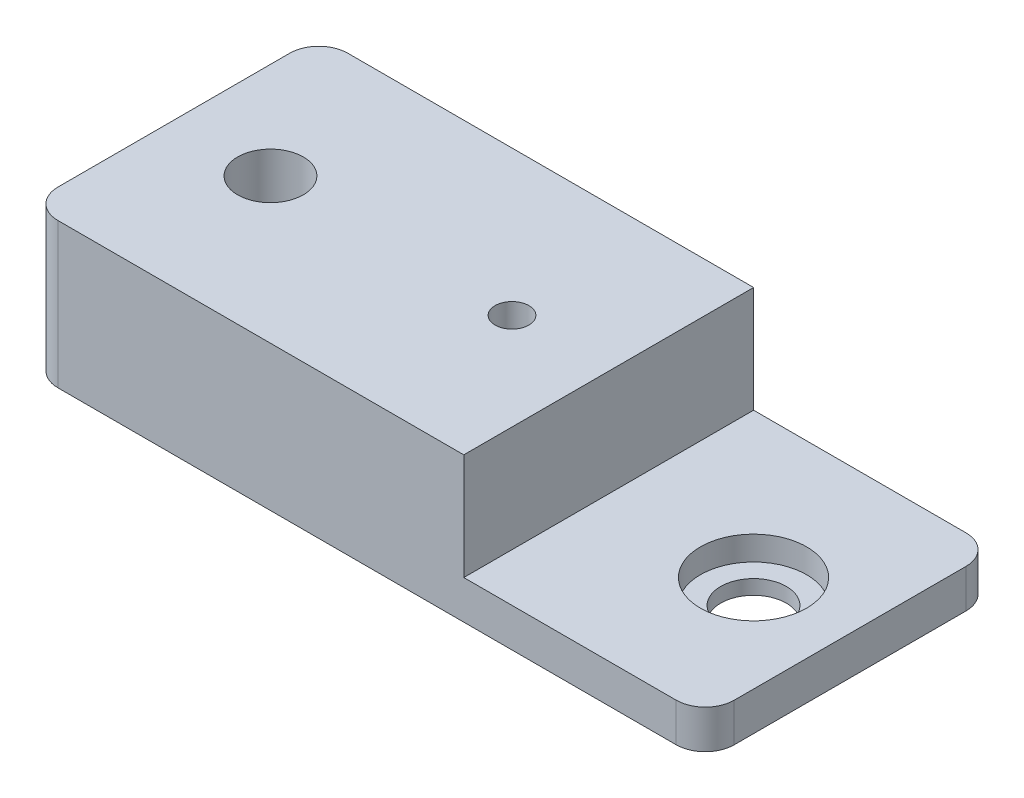
ISO-10303-21;
HEADER;
FILE_DESCRIPTION(('STEP AP214'),'2;1');
FILE_NAME('part.step','',(''),(''),'','','');
FILE_SCHEMA(('AUTOMOTIVE_DESIGN { 1 0 10303 214 1 1 1 1 }'));
ENDSEC;
DATA;
#1=APPLICATION_CONTEXT('core data for automotive mechanical design processes');
#2=APPLICATION_PROTOCOL_DEFINITION('international standard','automotive_design',2000,#1);
#3=PRODUCT_CONTEXT('',#1,'mechanical');
#4=PRODUCT('Part','Part','',(#3));
#5=PRODUCT_RELATED_PRODUCT_CATEGORY('part','',(#4));
#6=PRODUCT_DEFINITION_FORMATION('','',#4);
#7=PRODUCT_DEFINITION_CONTEXT('part definition',#1,'design');
#8=PRODUCT_DEFINITION('design','',#6,#7);
#9=PRODUCT_DEFINITION_SHAPE('','',#8);
#10=(LENGTH_UNIT() NAMED_UNIT(*) SI_UNIT(.MILLI.,.METRE.));
#11=(NAMED_UNIT(*) PLANE_ANGLE_UNIT() SI_UNIT($,.RADIAN.));
#12=(NAMED_UNIT(*) SI_UNIT($,.STERADIAN.) SOLID_ANGLE_UNIT());
#13=UNCERTAINTY_MEASURE_WITH_UNIT(LENGTH_MEASURE(1.E-05),#10,'distance_accuracy_value','');
#14=(GEOMETRIC_REPRESENTATION_CONTEXT(3) GLOBAL_UNCERTAINTY_ASSIGNED_CONTEXT((#13)) GLOBAL_UNIT_ASSIGNED_CONTEXT((#10,
#11,#12)) REPRESENTATION_CONTEXT('',''));
#15=CARTESIAN_POINT('',(0.,0.,0.));
#16=DIRECTION('',(0.,0.,1.));
#17=DIRECTION('',(1.,0.,0.));
#18=AXIS2_PLACEMENT_3D('',#15,#16,#17);
#19=CARTESIAN_POINT('',(25.,0.,0.));
#20=DIRECTION('',(0.,1.,0.));
#21=DIRECTION('',(0.,0.,1.));
#22=AXIS2_PLACEMENT_3D('',#19,#20,#21);
#23=CYLINDRICAL_SURFACE('',#22,3.4);
#24=CARTESIAN_POINT('',(25.,0.,0.));
#25=DIRECTION('',(0.,1.,0.));
#26=DIRECTION('',(0.,0.,1.));
#27=AXIS2_PLACEMENT_3D('',#24,#25,#26);
#28=CIRCLE('',#27,3.4);
#29=CARTESIAN_POINT('',(25.,0.,3.4));
#30=VERTEX_POINT('',#29);
#31=EDGE_CURVE('E229',#30,#30,#28,.T.);
#32=ORIENTED_EDGE('',*,*,#31,.F.);
#33=EDGE_LOOP('',(#32));
#34=FACE_BOUND('',#33,.T.);
#35=CARTESIAN_POINT('',(25.,1.5,0.));
#36=DIRECTION('',(0.,1.,0.));
#37=DIRECTION('',(0.,0.,1.));
#38=AXIS2_PLACEMENT_3D('',#35,#36,#37);
#39=CIRCLE('',#38,3.4);
#40=CARTESIAN_POINT('',(25.,1.5,3.4));
#41=VERTEX_POINT('',#40);
#42=EDGE_CURVE('E45',#41,#41,#39,.F.);
#43=ORIENTED_EDGE('',*,*,#42,.F.);
#44=EDGE_LOOP('',(#43));
#45=FACE_BOUND('',#44,.T.);
#46=ADVANCED_FACE('F41',(#34,#45),#23,.F.);
#47=CARTESIAN_POINT('',(0.,0.,0.));
#48=DIRECTION('',(0.,1.,0.));
#49=DIRECTION('',(0.,0.,1.));
#50=AXIS2_PLACEMENT_3D('',#47,#48,#49);
#51=CYLINDRICAL_SURFACE('',#50,1.75);
#52=CARTESIAN_POINT('',(0.,15.,0.));
#53=DIRECTION('',(0.,1.,0.));
#54=DIRECTION('',(0.,0.,1.));
#55=AXIS2_PLACEMENT_3D('',#52,#53,#54);
#56=CIRCLE('',#55,1.75);
#57=CARTESIAN_POINT('',(0.,15.,1.75));
#58=VERTEX_POINT('',#57);
#59=EDGE_CURVE('E189',#58,#58,#56,.T.);
#60=ORIENTED_EDGE('',*,*,#59,.T.);
#61=EDGE_LOOP('',(#60));
#62=FACE_BOUND('',#61,.T.);
#63=CARTESIAN_POINT('',(0.,7.8,0.));
#64=DIRECTION('',(0.,-1.,0.));
#65=DIRECTION('',(0.,0.,-1.));
#66=AXIS2_PLACEMENT_3D('',#63,#64,#65);
#67=CIRCLE('',#66,1.75);
#68=CARTESIAN_POINT('',(0.,7.8,-1.75));
#69=VERTEX_POINT('',#68);
#70=EDGE_CURVE('E227',#69,#69,#67,.F.);
#71=ORIENTED_EDGE('',*,*,#70,.F.);
#72=EDGE_LOOP('',(#71));
#73=FACE_BOUND('',#72,.T.);
#74=ADVANCED_FACE('F276',(#62,#73),#51,.F.);
#75=CARTESIAN_POINT('',(35.,15.,15.));
#76=DIRECTION('',(-1.,0.,0.));
#77=DIRECTION('',(0.,0.,1.));
#78=AXIS2_PLACEMENT_3D('',#75,#76,#77);
#79=PLANE('',#78);
#80=DIRECTION('',(0.,-1.,0.));
#81=VECTOR('',#80,1.);
#82=CARTESIAN_POINT('',(35.,15.,-12.));
#83=LINE('',#82,#81);
#84=CARTESIAN_POINT('',(35.,0.,-12.));
#85=VERTEX_POINT('',#84);
#86=CARTESIAN_POINT('',(35.,4.,-12.));
#87=VERTEX_POINT('',#86);
#88=EDGE_CURVE('E213',#85,#87,#83,.F.);
#89=ORIENTED_EDGE('',*,*,#88,.T.);
#90=DIRECTION('',(0.,0.,1.));
#91=VECTOR('',#90,1.);
#92=CARTESIAN_POINT('',(35.,4.,15.));
#93=LINE('',#92,#91);
#94=CARTESIAN_POINT('',(35.,4.,12.));
#95=VERTEX_POINT('',#94);
#96=EDGE_CURVE('E478',#87,#95,#93,.T.);
#97=ORIENTED_EDGE('',*,*,#96,.T.);
#98=DIRECTION('',(0.,-1.,0.));
#99=VECTOR('',#98,1.);
#100=CARTESIAN_POINT('',(35.,15.,12.));
#101=LINE('',#100,#99);
#102=CARTESIAN_POINT('',(35.,0.,12.));
#103=VERTEX_POINT('',#102);
#104=EDGE_CURVE('E211',#95,#103,#101,.T.);
#105=ORIENTED_EDGE('',*,*,#104,.T.);
#106=DIRECTION('',(0.,0.,-1.));
#107=VECTOR('',#106,1.);
#108=CARTESIAN_POINT('',(35.,0.,15.));
#109=LINE('',#108,#107);
#110=EDGE_CURVE('E193',#103,#85,#109,.T.);
#111=ORIENTED_EDGE('',*,*,#110,.T.);
#112=EDGE_LOOP('',(#89,#97,#105,#111));
#113=FACE_BOUND('',#112,.T.);
#114=ADVANCED_FACE('F279',(#113),#79,.F.);
#115=CARTESIAN_POINT('',(-35.,15.,-15.));
#116=DIRECTION('',(0.,0.,1.));
#117=DIRECTION('',(1.,0.,0.));
#118=AXIS2_PLACEMENT_3D('',#115,#116,#117);
#119=PLANE('',#118);
#120=DIRECTION('',(-1.,0.,0.));
#121=VECTOR('',#120,1.);
#122=CARTESIAN_POINT('',(-35.,15.,-15.));
#123=LINE('',#122,#121);
#124=CARTESIAN_POINT('',(10.0086904172408,15.,-15.));
#125=VERTEX_POINT('',#124);
#126=CARTESIAN_POINT('',(-32.,15.,-15.));
#127=VERTEX_POINT('',#126);
#128=EDGE_CURVE('E170',#125,#127,#123,.T.);
#129=ORIENTED_EDGE('',*,*,#128,.F.);
#130=DIRECTION('',(0.,-1.,0.));
#131=VECTOR('',#130,1.);
#132=CARTESIAN_POINT('',(10.0086904172408,15.,-15.));
#133=LINE('',#132,#131);
#134=CARTESIAN_POINT('',(10.0086904172408,4.,-15.));
#135=VERTEX_POINT('',#134);
#136=EDGE_CURVE('E156',#125,#135,#133,.T.);
#137=ORIENTED_EDGE('',*,*,#136,.T.);
#138=DIRECTION('',(1.,0.,0.));
#139=VECTOR('',#138,1.);
#140=CARTESIAN_POINT('',(-35.,4.,-15.));
#141=LINE('',#140,#139);
#142=CARTESIAN_POINT('',(32.,4.,-15.));
#143=VERTEX_POINT('',#142);
#144=EDGE_CURVE('E321',#135,#143,#141,.T.);
#145=ORIENTED_EDGE('',*,*,#144,.T.);
#146=DIRECTION('',(0.,-1.,0.));
#147=VECTOR('',#146,1.);
#148=CARTESIAN_POINT('',(32.,15.,-15.));
#149=LINE('',#148,#147);
#150=CARTESIAN_POINT('',(32.,0.,-15.));
#151=VERTEX_POINT('',#150);
#152=EDGE_CURVE('E201',#143,#151,#149,.T.);
#153=ORIENTED_EDGE('',*,*,#152,.T.);
#154=DIRECTION('',(-1.,0.,0.));
#155=VECTOR('',#154,1.);
#156=CARTESIAN_POINT('',(-35.,0.,-15.));
#157=LINE('',#156,#155);
#158=CARTESIAN_POINT('',(-32.,0.,-15.));
#159=VERTEX_POINT('',#158);
#160=EDGE_CURVE('E196',#151,#159,#157,.T.);
#161=ORIENTED_EDGE('',*,*,#160,.T.);
#162=DIRECTION('',(0.,-1.,0.));
#163=VECTOR('',#162,1.);
#164=CARTESIAN_POINT('',(-32.,15.,-15.));
#165=LINE('',#164,#163);
#166=EDGE_CURVE('E178',#159,#127,#165,.F.);
#167=ORIENTED_EDGE('',*,*,#166,.T.);
#168=EDGE_LOOP('',(#129,#137,#145,#153,#161,#167));
#169=FACE_BOUND('',#168,.T.);
#170=ADVANCED_FACE('F175',(#169),#119,.F.);
#171=CARTESIAN_POINT('',(-35.,15.,15.));
#172=DIRECTION('',(1.,0.,0.));
#173=DIRECTION('',(0.,0.,-1.));
#174=AXIS2_PLACEMENT_3D('',#171,#172,#173);
#175=PLANE('',#174);
#176=DIRECTION('',(0.,0.,1.));
#177=VECTOR('',#176,1.);
#178=CARTESIAN_POINT('',(-35.,0.,15.));
#179=LINE('',#178,#177);
#180=CARTESIAN_POINT('',(-35.,0.,-12.));
#181=VERTEX_POINT('',#180);
#182=CARTESIAN_POINT('',(-35.,0.,12.));
#183=VERTEX_POINT('',#182);
#184=EDGE_CURVE('E186',#181,#183,#179,.T.);
#185=ORIENTED_EDGE('',*,*,#184,.T.);
#186=DIRECTION('',(0.,-1.,0.));
#187=VECTOR('',#186,1.);
#188=CARTESIAN_POINT('',(-35.,15.,12.));
#189=LINE('',#188,#187);
#190=CARTESIAN_POINT('',(-35.,15.,12.));
#191=VERTEX_POINT('',#190);
#192=EDGE_CURVE('E11',#183,#191,#189,.F.);
#193=ORIENTED_EDGE('',*,*,#192,.T.);
#194=DIRECTION('',(0.,0.,1.));
#195=VECTOR('',#194,1.);
#196=CARTESIAN_POINT('',(-35.,15.,15.));
#197=LINE('',#196,#195);
#198=CARTESIAN_POINT('',(-35.,15.,-12.));
#199=VERTEX_POINT('',#198);
#200=EDGE_CURVE('E180',#199,#191,#197,.T.);
#201=ORIENTED_EDGE('',*,*,#200,.F.);
#202=DIRECTION('',(0.,-1.,0.));
#203=VECTOR('',#202,1.);
#204=CARTESIAN_POINT('',(-35.,15.,-12.));
#205=LINE('',#204,#203);
#206=EDGE_CURVE('E50',#199,#181,#205,.T.);
#207=ORIENTED_EDGE('',*,*,#206,.T.);
#208=EDGE_LOOP('',(#185,#193,#201,#207));
#209=FACE_BOUND('',#208,.T.);
#210=ADVANCED_FACE('F296',(#209),#175,.F.);
#211=CARTESIAN_POINT('',(-35.,15.,15.));
#212=DIRECTION('',(0.,0.,-1.));
#213=DIRECTION('',(-1.,0.,0.));
#214=AXIS2_PLACEMENT_3D('',#211,#212,#213);
#215=PLANE('',#214);
#216=DIRECTION('',(-1.,0.,0.));
#217=VECTOR('',#216,1.);
#218=CARTESIAN_POINT('',(-35.,4.,15.));
#219=LINE('',#218,#217);
#220=CARTESIAN_POINT('',(32.,4.,15.));
#221=VERTEX_POINT('',#220);
#222=CARTESIAN_POINT('',(10.0086904172408,4.,15.));
#223=VERTEX_POINT('',#222);
#224=EDGE_CURVE('E58',#221,#223,#219,.T.);
#225=ORIENTED_EDGE('',*,*,#224,.T.);
#226=DIRECTION('',(0.,1.,0.));
#227=VECTOR('',#226,1.);
#228=CARTESIAN_POINT('',(10.0086904172408,15.,15.));
#229=LINE('',#228,#227);
#230=CARTESIAN_POINT('',(10.0086904172408,15.,15.));
#231=VERTEX_POINT('',#230);
#232=EDGE_CURVE('E165',#223,#231,#229,.T.);
#233=ORIENTED_EDGE('',*,*,#232,.T.);
#234=DIRECTION('',(1.,0.,0.));
#235=VECTOR('',#234,1.);
#236=CARTESIAN_POINT('',(-35.,15.,15.));
#237=LINE('',#236,#235);
#238=CARTESIAN_POINT('',(-32.,15.,15.));
#239=VERTEX_POINT('',#238);
#240=EDGE_CURVE('E173',#239,#231,#237,.T.);
#241=ORIENTED_EDGE('',*,*,#240,.F.);
#242=DIRECTION('',(0.,-1.,0.));
#243=VECTOR('',#242,1.);
#244=CARTESIAN_POINT('',(-32.,15.,15.));
#245=LINE('',#244,#243);
#246=CARTESIAN_POINT('',(-32.,0.,15.));
#247=VERTEX_POINT('',#246);
#248=EDGE_CURVE('E220',#239,#247,#245,.T.);
#249=ORIENTED_EDGE('',*,*,#248,.T.);
#250=DIRECTION('',(1.,0.,0.));
#251=VECTOR('',#250,1.);
#252=CARTESIAN_POINT('',(-35.,0.,15.));
#253=LINE('',#252,#251);
#254=CARTESIAN_POINT('',(32.,0.,15.));
#255=VERTEX_POINT('',#254);
#256=EDGE_CURVE('E181',#247,#255,#253,.T.);
#257=ORIENTED_EDGE('',*,*,#256,.T.);
#258=DIRECTION('',(0.,-1.,0.));
#259=VECTOR('',#258,1.);
#260=CARTESIAN_POINT('',(32.,15.,15.));
#261=LINE('',#260,#259);
#262=EDGE_CURVE('E223',#255,#221,#261,.F.);
#263=ORIENTED_EDGE('',*,*,#262,.T.);
#264=EDGE_LOOP('',(#225,#233,#241,#249,#257,#263));
#265=FACE_BOUND('',#264,.T.);
#266=ADVANCED_FACE('F271',(#265),#215,.F.);
#267=CARTESIAN_POINT('',(0.,15.,0.));
#268=DIRECTION('',(0.,-1.,0.));
#269=DIRECTION('',(0.,0.,-1.));
#270=AXIS2_PLACEMENT_3D('',#267,#268,#269);
#271=PLANE('',#270);
#272=CARTESIAN_POINT('',(-25.,15.,0.));
#273=DIRECTION('',(0.,1.,0.));
#274=DIRECTION('',(0.,0.,1.));
#275=AXIS2_PLACEMENT_3D('',#272,#273,#274);
#276=CIRCLE('',#275,3.4);
#277=CARTESIAN_POINT('',(-25.,15.,3.4));
#278=VERTEX_POINT('',#277);
#279=EDGE_CURVE('E253',#278,#278,#276,.T.);
#280=ORIENTED_EDGE('',*,*,#279,.F.);
#281=EDGE_LOOP('',(#280));
#282=FACE_BOUND('',#281,.T.);
#283=ORIENTED_EDGE('',*,*,#59,.F.);
#284=EDGE_LOOP('',(#283));
#285=FACE_BOUND('',#284,.T.);
#286=ORIENTED_EDGE('',*,*,#240,.T.);
#287=DIRECTION('',(0.,0.,1.));
#288=VECTOR('',#287,1.);
#289=CARTESIAN_POINT('',(10.0086904172408,15.,-16.8498165974971));
#290=LINE('',#289,#288);
#291=EDGE_CURVE('E159',#125,#231,#290,.T.);
#292=ORIENTED_EDGE('',*,*,#291,.F.);
#293=ORIENTED_EDGE('',*,*,#128,.T.);
#294=CARTESIAN_POINT('',(-32.,15.,-12.));
#295=DIRECTION('',(0.,-1.,0.));
#296=DIRECTION('',(0.,0.,-1.));
#297=AXIS2_PLACEMENT_3D('',#294,#295,#296);
#298=CIRCLE('',#297,3.);
#299=EDGE_CURVE('E216',#127,#199,#298,.F.);
#300=ORIENTED_EDGE('',*,*,#299,.T.);
#301=ORIENTED_EDGE('',*,*,#200,.T.);
#302=CARTESIAN_POINT('',(-32.,15.,12.));
#303=DIRECTION('',(0.,-1.,0.));
#304=DIRECTION('',(0.,0.,-1.));
#305=AXIS2_PLACEMENT_3D('',#302,#303,#304);
#306=CIRCLE('',#305,3.);
#307=EDGE_CURVE('E218',#191,#239,#306,.F.);
#308=ORIENTED_EDGE('',*,*,#307,.T.);
#309=EDGE_LOOP('',(#286,#292,#293,#300,#301,#308));
#310=FACE_BOUND('',#309,.T.);
#311=ADVANCED_FACE('F169',(#282,#285,#310),#271,.F.);
#312=CARTESIAN_POINT('',(0.,0.,0.));
#313=DIRECTION('',(0.,-1.,0.));
#314=DIRECTION('',(0.,0.,-1.));
#315=AXIS2_PLACEMENT_3D('',#312,#313,#314);
#316=PLANE('',#315);
#317=DIRECTION('',(-0.866025403784439,0.,0.5));
#318=VECTOR('',#317,1.);
#319=CARTESIAN_POINT('',(3.1,0.,1.78978583448784));
#320=LINE('',#319,#318);
#321=CARTESIAN_POINT('',(3.1,0.,1.78978583448784));
#322=VERTEX_POINT('',#321);
#323=CARTESIAN_POINT('',(0.,0.,3.57957166897568));
#324=VERTEX_POINT('',#323);
#325=EDGE_CURVE('E66',#322,#324,#320,.T.);
#326=ORIENTED_EDGE('',*,*,#325,.F.);
#327=DIRECTION('',(0.,0.,1.));
#328=VECTOR('',#327,1.);
#329=CARTESIAN_POINT('',(3.1,0.,-1.78978583448784));
#330=LINE('',#329,#328);
#331=CARTESIAN_POINT('',(3.1,0.,-1.78978583448784));
#332=VERTEX_POINT('',#331);
#333=EDGE_CURVE('E242',#332,#322,#330,.T.);
#334=ORIENTED_EDGE('',*,*,#333,.F.);
#335=DIRECTION('',(0.866025403784439,0.,0.5));
#336=VECTOR('',#335,1.);
#337=CARTESIAN_POINT('',(0.,0.,-3.57957166897568));
#338=LINE('',#337,#336);
#339=CARTESIAN_POINT('',(0.,0.,-3.57957166897568));
#340=VERTEX_POINT('',#339);
#341=EDGE_CURVE('E353',#340,#332,#338,.T.);
#342=ORIENTED_EDGE('',*,*,#341,.F.);
#343=DIRECTION('',(0.866025403784439,0.,-0.5));
#344=VECTOR('',#343,1.);
#345=CARTESIAN_POINT('',(-3.1,0.,-1.78978583448784));
#346=LINE('',#345,#344);
#347=CARTESIAN_POINT('',(-3.1,0.,-1.78978583448784));
#348=VERTEX_POINT('',#347);
#349=EDGE_CURVE('E351',#348,#340,#346,.T.);
#350=ORIENTED_EDGE('',*,*,#349,.F.);
#351=DIRECTION('',(0.,0.,-1.));
#352=VECTOR('',#351,1.);
#353=CARTESIAN_POINT('',(-3.1,0.,1.78978583448784));
#354=LINE('',#353,#352);
#355=CARTESIAN_POINT('',(-3.1,0.,1.78978583448784));
#356=VERTEX_POINT('',#355);
#357=EDGE_CURVE('E348',#356,#348,#354,.T.);
#358=ORIENTED_EDGE('',*,*,#357,.F.);
#359=DIRECTION('',(-0.866025403784439,0.,-0.5));
#360=VECTOR('',#359,1.);
#361=CARTESIAN_POINT('',(0.,0.,3.57957166897568));
#362=LINE('',#361,#360);
#363=EDGE_CURVE('E345',#324,#356,#362,.T.);
#364=ORIENTED_EDGE('',*,*,#363,.F.);
#365=EDGE_LOOP('',(#326,#334,#342,#350,#358,#364));
#366=FACE_BOUND('',#365,.T.);
#367=ORIENTED_EDGE('',*,*,#31,.T.);
#368=EDGE_LOOP('',(#367));
#369=FACE_BOUND('',#368,.T.);
#370=CARTESIAN_POINT('',(-25.,0.,0.));
#371=DIRECTION('',(0.,1.,0.));
#372=DIRECTION('',(0.,0.,1.));
#373=AXIS2_PLACEMENT_3D('',#370,#371,#372);
#374=CIRCLE('',#373,3.4);
#375=CARTESIAN_POINT('',(-25.,0.,3.4));
#376=VERTEX_POINT('',#375);
#377=EDGE_CURVE('E234',#376,#376,#374,.T.);
#378=ORIENTED_EDGE('',*,*,#377,.T.);
#379=EDGE_LOOP('',(#378));
#380=FACE_BOUND('',#379,.T.);
#381=ORIENTED_EDGE('',*,*,#160,.F.);
#382=CARTESIAN_POINT('',(32.,0.,-12.));
#383=DIRECTION('',(0.,-1.,0.));
#384=DIRECTION('',(0.,0.,-1.));
#385=AXIS2_PLACEMENT_3D('',#382,#383,#384);
#386=CIRCLE('',#385,3.);
#387=EDGE_CURVE('E209',#151,#85,#386,.T.);
#388=ORIENTED_EDGE('',*,*,#387,.T.);
#389=ORIENTED_EDGE('',*,*,#110,.F.);
#390=CARTESIAN_POINT('',(32.,0.,12.));
#391=DIRECTION('',(0.,-1.,0.));
#392=DIRECTION('',(0.,0.,-1.));
#393=AXIS2_PLACEMENT_3D('',#390,#391,#392);
#394=CIRCLE('',#393,3.);
#395=EDGE_CURVE('E207',#103,#255,#394,.T.);
#396=ORIENTED_EDGE('',*,*,#395,.T.);
#397=ORIENTED_EDGE('',*,*,#256,.F.);
#398=CARTESIAN_POINT('',(-32.,0.,12.));
#399=DIRECTION('',(0.,-1.,0.));
#400=DIRECTION('',(0.,0.,-1.));
#401=AXIS2_PLACEMENT_3D('',#398,#399,#400);
#402=CIRCLE('',#401,3.);
#403=EDGE_CURVE('E205',#247,#183,#402,.T.);
#404=ORIENTED_EDGE('',*,*,#403,.T.);
#405=ORIENTED_EDGE('',*,*,#184,.F.);
#406=CARTESIAN_POINT('',(-32.,0.,-12.));
#407=DIRECTION('',(0.,-1.,0.));
#408=DIRECTION('',(0.,0.,-1.));
#409=AXIS2_PLACEMENT_3D('',#406,#407,#408);
#410=CIRCLE('',#409,3.);
#411=EDGE_CURVE('E203',#181,#159,#410,.T.);
#412=ORIENTED_EDGE('',*,*,#411,.T.);
#413=EDGE_LOOP('',(#381,#388,#389,#396,#397,#404,#405,#412));
#414=FACE_BOUND('',#413,.T.);
#415=ADVANCED_FACE('F259',(#366,#369,#380,#414),#316,.T.);
#416=CARTESIAN_POINT('',(32.,15.,-12.));
#417=DIRECTION('',(0.,-1.,0.));
#418=DIRECTION('',(0.,0.,-1.));
#419=AXIS2_PLACEMENT_3D('',#416,#417,#418);
#420=CYLINDRICAL_SURFACE('',#419,3.);
#421=CARTESIAN_POINT('',(32.,4.,-12.));
#422=DIRECTION('',(0.,-1.,0.));
#423=DIRECTION('',(0.,0.,-1.));
#424=AXIS2_PLACEMENT_3D('',#421,#422,#423);
#425=CIRCLE('',#424,3.);
#426=EDGE_CURVE('E323',#87,#143,#425,.F.);
#427=ORIENTED_EDGE('',*,*,#426,.F.);
#428=ORIENTED_EDGE('',*,*,#88,.F.);
#429=ORIENTED_EDGE('',*,*,#387,.F.);
#430=ORIENTED_EDGE('',*,*,#152,.F.);
#431=EDGE_LOOP('',(#427,#428,#429,#430));
#432=FACE_BOUND('',#431,.T.);
#433=ADVANCED_FACE('F292',(#432),#420,.T.);
#434=CARTESIAN_POINT('',(32.,15.,12.));
#435=DIRECTION('',(0.,-1.,0.));
#436=DIRECTION('',(0.,0.,-1.));
#437=AXIS2_PLACEMENT_3D('',#434,#435,#436);
#438=CYLINDRICAL_SURFACE('',#437,3.);
#439=CARTESIAN_POINT('',(32.,4.,12.));
#440=DIRECTION('',(0.,-1.,0.));
#441=DIRECTION('',(0.,0.,-1.));
#442=AXIS2_PLACEMENT_3D('',#439,#440,#441);
#443=CIRCLE('',#442,3.);
#444=EDGE_CURVE('E474',#221,#95,#443,.F.);
#445=ORIENTED_EDGE('',*,*,#444,.F.);
#446=ORIENTED_EDGE('',*,*,#262,.F.);
#447=ORIENTED_EDGE('',*,*,#395,.F.);
#448=ORIENTED_EDGE('',*,*,#104,.F.);
#449=EDGE_LOOP('',(#445,#446,#447,#448));
#450=FACE_BOUND('',#449,.T.);
#451=ADVANCED_FACE('F305',(#450),#438,.T.);
#452=CARTESIAN_POINT('',(-32.,15.,12.));
#453=DIRECTION('',(0.,-1.,0.));
#454=DIRECTION('',(0.,0.,-1.));
#455=AXIS2_PLACEMENT_3D('',#452,#453,#454);
#456=CYLINDRICAL_SURFACE('',#455,3.);
#457=ORIENTED_EDGE('',*,*,#307,.F.);
#458=ORIENTED_EDGE('',*,*,#192,.F.);
#459=ORIENTED_EDGE('',*,*,#403,.F.);
#460=ORIENTED_EDGE('',*,*,#248,.F.);
#461=EDGE_LOOP('',(#457,#458,#459,#460));
#462=FACE_BOUND('',#461,.T.);
#463=ADVANCED_FACE('F308',(#462),#456,.T.);
#464=CARTESIAN_POINT('',(-32.,15.,-12.));
#465=DIRECTION('',(0.,-1.,0.));
#466=DIRECTION('',(0.,0.,-1.));
#467=AXIS2_PLACEMENT_3D('',#464,#465,#466);
#468=CYLINDRICAL_SURFACE('',#467,3.);
#469=ORIENTED_EDGE('',*,*,#299,.F.);
#470=ORIENTED_EDGE('',*,*,#166,.F.);
#471=ORIENTED_EDGE('',*,*,#411,.F.);
#472=ORIENTED_EDGE('',*,*,#206,.F.);
#473=EDGE_LOOP('',(#469,#470,#471,#472));
#474=FACE_BOUND('',#473,.T.);
#475=ADVANCED_FACE('F43',(#474),#468,.T.);
#476=CARTESIAN_POINT('',(-25.,0.,0.));
#477=DIRECTION('',(0.,1.,0.));
#478=DIRECTION('',(0.,0.,1.));
#479=AXIS2_PLACEMENT_3D('',#476,#477,#478);
#480=CYLINDRICAL_SURFACE('',#479,3.4);
#481=ORIENTED_EDGE('',*,*,#377,.F.);
#482=EDGE_LOOP('',(#481));
#483=FACE_BOUND('',#482,.T.);
#484=ORIENTED_EDGE('',*,*,#279,.T.);
#485=EDGE_LOOP('',(#484));
#486=FACE_BOUND('',#485,.T.);
#487=ADVANCED_FACE('F262',(#483,#486),#480,.F.);
#488=CARTESIAN_POINT('',(0.,7.8,0.));
#489=DIRECTION('',(0.,-1.,0.));
#490=DIRECTION('',(0.,0.,-1.));
#491=AXIS2_PLACEMENT_3D('',#488,#489,#490);
#492=PLANE('',#491);
#493=DIRECTION('',(-0.866025403784439,0.,0.5));
#494=VECTOR('',#493,1.);
#495=CARTESIAN_POINT('',(3.1,7.8,1.78978583448784));
#496=LINE('',#495,#494);
#497=CARTESIAN_POINT('',(3.1,7.8,1.78978583448784));
#498=VERTEX_POINT('',#497);
#499=CARTESIAN_POINT('',(0.,7.8,3.57957166897568));
#500=VERTEX_POINT('',#499);
#501=EDGE_CURVE('E327',#498,#500,#496,.T.);
#502=ORIENTED_EDGE('',*,*,#501,.T.);
#503=DIRECTION('',(-0.866025403784439,0.,-0.5));
#504=VECTOR('',#503,1.);
#505=CARTESIAN_POINT('',(0.,7.8,3.57957166897568));
#506=LINE('',#505,#504);
#507=CARTESIAN_POINT('',(-3.1,7.8,1.78978583448784));
#508=VERTEX_POINT('',#507);
#509=EDGE_CURVE('E330',#500,#508,#506,.T.);
#510=ORIENTED_EDGE('',*,*,#509,.T.);
#511=DIRECTION('',(0.,0.,-1.));
#512=VECTOR('',#511,1.);
#513=CARTESIAN_POINT('',(-3.1,7.8,1.78978583448784));
#514=LINE('',#513,#512);
#515=CARTESIAN_POINT('',(-3.1,7.8,-1.78978583448784));
#516=VERTEX_POINT('',#515);
#517=EDGE_CURVE('E333',#508,#516,#514,.T.);
#518=ORIENTED_EDGE('',*,*,#517,.T.);
#519=DIRECTION('',(0.866025403784439,0.,-0.5));
#520=VECTOR('',#519,1.);
#521=CARTESIAN_POINT('',(-3.1,7.8,-1.78978583448784));
#522=LINE('',#521,#520);
#523=CARTESIAN_POINT('',(0.,7.8,-3.57957166897568));
#524=VERTEX_POINT('',#523);
#525=EDGE_CURVE('E336',#516,#524,#522,.T.);
#526=ORIENTED_EDGE('',*,*,#525,.T.);
#527=DIRECTION('',(0.866025403784439,0.,0.5));
#528=VECTOR('',#527,1.);
#529=CARTESIAN_POINT('',(0.,7.8,-3.57957166897568));
#530=LINE('',#529,#528);
#531=CARTESIAN_POINT('',(3.1,7.8,-1.78978583448784));
#532=VERTEX_POINT('',#531);
#533=EDGE_CURVE('E339',#524,#532,#530,.T.);
#534=ORIENTED_EDGE('',*,*,#533,.T.);
#535=DIRECTION('',(0.,0.,1.));
#536=VECTOR('',#535,1.);
#537=CARTESIAN_POINT('',(3.1,7.8,-1.78978583448784));
#538=LINE('',#537,#536);
#539=EDGE_CURVE('E252',#532,#498,#538,.T.);
#540=ORIENTED_EDGE('',*,*,#539,.T.);
#541=EDGE_LOOP('',(#502,#510,#518,#526,#534,#540));
#542=FACE_BOUND('',#541,.T.);
#543=ORIENTED_EDGE('',*,*,#70,.T.);
#544=EDGE_LOOP('',(#543));
#545=FACE_BOUND('',#544,.T.);
#546=ADVANCED_FACE('F265',(#542,#545),#492,.T.);
#547=CARTESIAN_POINT('',(3.1,7.8,1.78978583448784));
#548=DIRECTION('',(0.5,0.,0.866025403784439));
#549=DIRECTION('',(0.866025403784439,0.,-0.5));
#550=AXIS2_PLACEMENT_3D('',#547,#548,#549);
#551=PLANE('',#550);
#552=ORIENTED_EDGE('',*,*,#325,.T.);
#553=DIRECTION('',(0.,-1.,0.));
#554=VECTOR('',#553,1.);
#555=CARTESIAN_POINT('',(0.,7.8,3.57957166897568));
#556=LINE('',#555,#554);
#557=EDGE_CURVE('E250',#500,#324,#556,.T.);
#558=ORIENTED_EDGE('',*,*,#557,.F.);
#559=ORIENTED_EDGE('',*,*,#501,.F.);
#560=DIRECTION('',(0.,-1.,0.));
#561=VECTOR('',#560,1.);
#562=CARTESIAN_POINT('',(3.1,7.8,1.78978583448784));
#563=LINE('',#562,#561);
#564=EDGE_CURVE('E230',#498,#322,#563,.T.);
#565=ORIENTED_EDGE('',*,*,#564,.T.);
#566=EDGE_LOOP('',(#552,#558,#559,#565));
#567=FACE_BOUND('',#566,.T.);
#568=ADVANCED_FACE('F369',(#567),#551,.F.);
#569=CARTESIAN_POINT('',(3.1,7.8,-1.78978583448784));
#570=DIRECTION('',(1.,0.,0.));
#571=DIRECTION('',(0.,0.,-1.));
#572=AXIS2_PLACEMENT_3D('',#569,#570,#571);
#573=PLANE('',#572);
#574=ORIENTED_EDGE('',*,*,#333,.T.);
#575=ORIENTED_EDGE('',*,*,#564,.F.);
#576=ORIENTED_EDGE('',*,*,#539,.F.);
#577=DIRECTION('',(0.,-1.,0.));
#578=VECTOR('',#577,1.);
#579=CARTESIAN_POINT('',(3.1,7.8,-1.78978583448784));
#580=LINE('',#579,#578);
#581=EDGE_CURVE('E235',#532,#332,#580,.T.);
#582=ORIENTED_EDGE('',*,*,#581,.T.);
#583=EDGE_LOOP('',(#574,#575,#576,#582));
#584=FACE_BOUND('',#583,.T.);
#585=ADVANCED_FACE('F359',(#584),#573,.F.);
#586=CARTESIAN_POINT('',(0.,7.8,-3.57957166897568));
#587=DIRECTION('',(0.5,0.,-0.866025403784439));
#588=DIRECTION('',(-0.866025403784439,0.,-0.5));
#589=AXIS2_PLACEMENT_3D('',#586,#587,#588);
#590=PLANE('',#589);
#591=ORIENTED_EDGE('',*,*,#341,.T.);
#592=ORIENTED_EDGE('',*,*,#581,.F.);
#593=ORIENTED_EDGE('',*,*,#533,.F.);
#594=DIRECTION('',(0.,-1.,0.));
#595=VECTOR('',#594,1.);
#596=CARTESIAN_POINT('',(0.,7.8,-3.57957166897568));
#597=LINE('',#596,#595);
#598=EDGE_CURVE('E239',#524,#340,#597,.T.);
#599=ORIENTED_EDGE('',*,*,#598,.T.);
#600=EDGE_LOOP('',(#591,#592,#593,#599));
#601=FACE_BOUND('',#600,.T.);
#602=ADVANCED_FACE('F373',(#601),#590,.F.);
#603=CARTESIAN_POINT('',(-3.1,7.8,-1.78978583448784));
#604=DIRECTION('',(-0.5,0.,-0.866025403784439));
#605=DIRECTION('',(-0.866025403784439,0.,0.5));
#606=AXIS2_PLACEMENT_3D('',#603,#604,#605);
#607=PLANE('',#606);
#608=ORIENTED_EDGE('',*,*,#349,.T.);
#609=ORIENTED_EDGE('',*,*,#598,.F.);
#610=ORIENTED_EDGE('',*,*,#525,.F.);
#611=DIRECTION('',(0.,-1.,0.));
#612=VECTOR('',#611,1.);
#613=CARTESIAN_POINT('',(-3.1,7.8,-1.78978583448784));
#614=LINE('',#613,#612);
#615=EDGE_CURVE('E246',#516,#348,#614,.T.);
#616=ORIENTED_EDGE('',*,*,#615,.T.);
#617=EDGE_LOOP('',(#608,#609,#610,#616));
#618=FACE_BOUND('',#617,.T.);
#619=ADVANCED_FACE('F375',(#618),#607,.F.);
#620=CARTESIAN_POINT('',(-3.1,7.8,1.78978583448784));
#621=DIRECTION('',(-1.,0.,0.));
#622=DIRECTION('',(0.,0.,1.));
#623=AXIS2_PLACEMENT_3D('',#620,#621,#622);
#624=PLANE('',#623);
#625=ORIENTED_EDGE('',*,*,#357,.T.);
#626=ORIENTED_EDGE('',*,*,#615,.F.);
#627=ORIENTED_EDGE('',*,*,#517,.F.);
#628=DIRECTION('',(0.,-1.,0.));
#629=VECTOR('',#628,1.);
#630=CARTESIAN_POINT('',(-3.1,7.8,1.78978583448784));
#631=LINE('',#630,#629);
#632=EDGE_CURVE('E248',#508,#356,#631,.T.);
#633=ORIENTED_EDGE('',*,*,#632,.T.);
#634=EDGE_LOOP('',(#625,#626,#627,#633));
#635=FACE_BOUND('',#634,.T.);
#636=ADVANCED_FACE('F377',(#635),#624,.F.);
#637=CARTESIAN_POINT('',(0.,7.8,3.57957166897568));
#638=DIRECTION('',(-0.5,0.,0.866025403784439));
#639=DIRECTION('',(0.866025403784439,0.,0.5));
#640=AXIS2_PLACEMENT_3D('',#637,#638,#639);
#641=PLANE('',#640);
#642=ORIENTED_EDGE('',*,*,#363,.T.);
#643=ORIENTED_EDGE('',*,*,#632,.F.);
#644=ORIENTED_EDGE('',*,*,#509,.F.);
#645=ORIENTED_EDGE('',*,*,#557,.T.);
#646=EDGE_LOOP('',(#642,#643,#644,#645));
#647=FACE_BOUND('',#646,.T.);
#648=ADVANCED_FACE('F366',(#647),#641,.F.);
#649=CARTESIAN_POINT('',(10.0086904172408,4.,-16.8498165974971));
#650=DIRECTION('',(-1.,0.,0.));
#651=DIRECTION('',(0.,0.,1.));
#652=AXIS2_PLACEMENT_3D('',#649,#650,#651);
#653=PLANE('',#652);
#654=ORIENTED_EDGE('',*,*,#291,.T.);
#655=ORIENTED_EDGE('',*,*,#232,.F.);
#656=DIRECTION('',(0.,0.,1.));
#657=VECTOR('',#656,1.);
#658=CARTESIAN_POINT('',(10.0086904172408,4.,-16.8498165974971));
#659=LINE('',#658,#657);
#660=EDGE_CURVE('E161',#135,#223,#659,.T.);
#661=ORIENTED_EDGE('',*,*,#660,.F.);
#662=ORIENTED_EDGE('',*,*,#136,.F.);
#663=EDGE_LOOP('',(#654,#655,#661,#662));
#664=FACE_BOUND('',#663,.T.);
#665=ADVANCED_FACE('F158',(#664),#653,.F.);
#666=CARTESIAN_POINT('',(0.,4.,0.));
#667=DIRECTION('',(0.,-1.,0.));
#668=DIRECTION('',(0.,0.,-1.));
#669=AXIS2_PLACEMENT_3D('',#666,#667,#668);
#670=PLANE('',#669);
#671=CARTESIAN_POINT('',(25.,4.,0.));
#672=DIRECTION('',(0.,1.,0.));
#673=DIRECTION('',(0.,0.,1.));
#674=AXIS2_PLACEMENT_3D('',#671,#672,#673);
#675=CIRCLE('',#674,5.5);
#676=CARTESIAN_POINT('',(25.,4.,5.5));
#677=VERTEX_POINT('',#676);
#678=EDGE_CURVE('E470',#677,#677,#675,.T.);
#679=ORIENTED_EDGE('',*,*,#678,.F.);
#680=EDGE_LOOP('',(#679));
#681=FACE_BOUND('',#680,.T.);
#682=ORIENTED_EDGE('',*,*,#660,.T.);
#683=ORIENTED_EDGE('',*,*,#224,.F.);
#684=ORIENTED_EDGE('',*,*,#444,.T.);
#685=ORIENTED_EDGE('',*,*,#96,.F.);
#686=ORIENTED_EDGE('',*,*,#426,.T.);
#687=ORIENTED_EDGE('',*,*,#144,.F.);
#688=EDGE_LOOP('',(#682,#683,#684,#685,#686,#687));
#689=FACE_BOUND('',#688,.T.);
#690=ADVANCED_FACE('F429',(#681,#689),#670,.F.);
#691=CARTESIAN_POINT('',(25.,1.5,0.));
#692=DIRECTION('',(0.,1.,0.));
#693=DIRECTION('',(0.,0.,1.));
#694=AXIS2_PLACEMENT_3D('',#691,#692,#693);
#695=PLANE('',#694);
#696=CARTESIAN_POINT('',(25.,1.5,0.));
#697=DIRECTION('',(0.,1.,0.));
#698=DIRECTION('',(0.,0.,1.));
#699=AXIS2_PLACEMENT_3D('',#696,#697,#698);
#700=CIRCLE('',#699,5.5);
#701=CARTESIAN_POINT('',(25.,1.5,5.5));
#702=VERTEX_POINT('',#701);
#703=EDGE_CURVE('E467',#702,#702,#700,.T.);
#704=ORIENTED_EDGE('',*,*,#703,.T.);
#705=EDGE_LOOP('',(#704));
#706=FACE_BOUND('',#705,.T.);
#707=ORIENTED_EDGE('',*,*,#42,.T.);
#708=EDGE_LOOP('',(#707));
#709=FACE_BOUND('',#708,.T.);
#710=ADVANCED_FACE('F437',(#706,#709),#695,.T.);
#711=CARTESIAN_POINT('',(25.,1.5,0.));
#712=DIRECTION('',(0.,1.,0.));
#713=DIRECTION('',(0.,0.,1.));
#714=AXIS2_PLACEMENT_3D('',#711,#712,#713);
#715=CYLINDRICAL_SURFACE('',#714,5.5);
#716=ORIENTED_EDGE('',*,*,#703,.F.);
#717=EDGE_LOOP('',(#716));
#718=FACE_BOUND('',#717,.T.);
#719=ORIENTED_EDGE('',*,*,#678,.T.);
#720=EDGE_LOOP('',(#719));
#721=FACE_BOUND('',#720,.T.);
#722=ADVANCED_FACE('F451',(#718,#721),#715,.F.);
#723=CLOSED_SHELL('',(#46,#74,#114,#170,#210,#266,#311,#415,#433,#451,#463,#475,#487,#546,#568,
#585,#602,#619,#636,#648,#665,#690,#710,#722));
#724=MANIFOLD_SOLID_BREP('B2',#723);
#725=ADVANCED_BREP_SHAPE_REPRESENTATION('',(#18,#724),#14);
#726=SHAPE_DEFINITION_REPRESENTATION(#9,#725);
ENDSEC;
END-ISO-10303-21;
